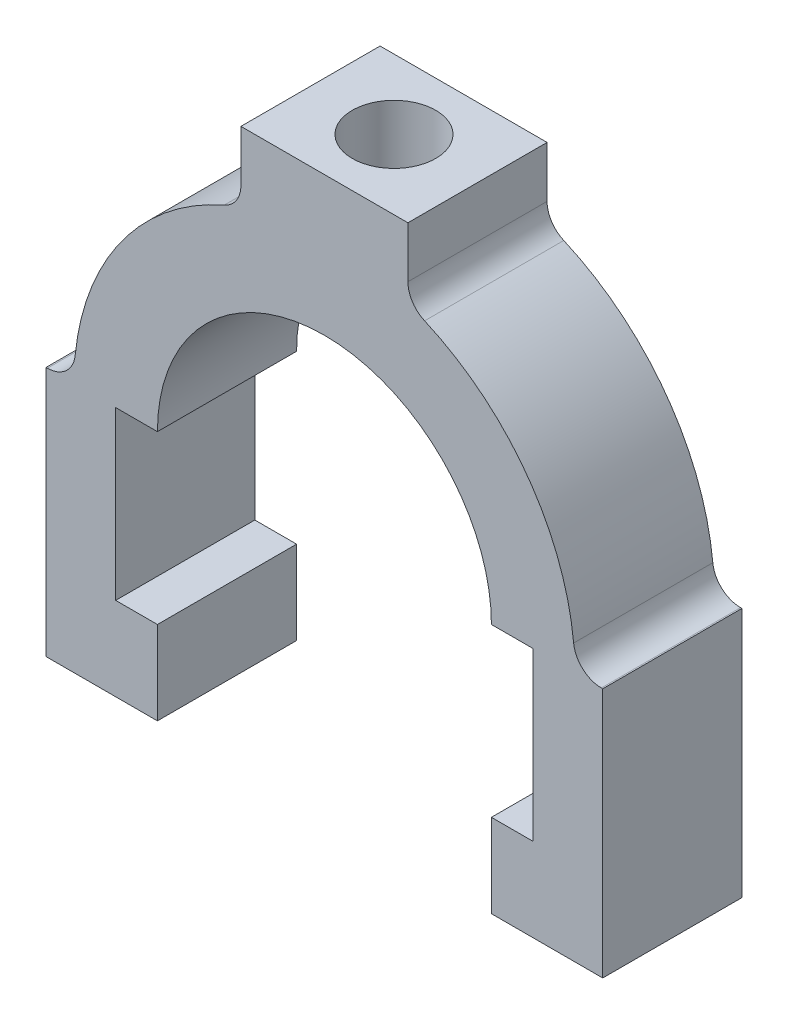
ISO-10303-21;
HEADER;
FILE_DESCRIPTION(('STEP AP214'),'2;1');
FILE_NAME('part.step','',(''),(''),'','','');
FILE_SCHEMA(('AUTOMOTIVE_DESIGN { 1 0 10303 214 1 1 1 1 }'));
ENDSEC;
DATA;
#1=APPLICATION_CONTEXT('core data for automotive mechanical design processes');
#2=APPLICATION_PROTOCOL_DEFINITION('international standard','automotive_design',2000,#1);
#3=PRODUCT_CONTEXT('',#1,'mechanical');
#4=PRODUCT('Part','Part','',(#3));
#5=PRODUCT_RELATED_PRODUCT_CATEGORY('part','',(#4));
#6=PRODUCT_DEFINITION_FORMATION('','',#4);
#7=PRODUCT_DEFINITION_CONTEXT('part definition',#1,'design');
#8=PRODUCT_DEFINITION('design','',#6,#7);
#9=PRODUCT_DEFINITION_SHAPE('','',#8);
#10=(LENGTH_UNIT() NAMED_UNIT(*) SI_UNIT(.MILLI.,.METRE.));
#11=(NAMED_UNIT(*) PLANE_ANGLE_UNIT() SI_UNIT($,.RADIAN.));
#12=(NAMED_UNIT(*) SI_UNIT($,.STERADIAN.) SOLID_ANGLE_UNIT());
#13=UNCERTAINTY_MEASURE_WITH_UNIT(LENGTH_MEASURE(1.E-05),#10,'distance_accuracy_value','');
#14=(GEOMETRIC_REPRESENTATION_CONTEXT(3) GLOBAL_UNCERTAINTY_ASSIGNED_CONTEXT((#13)) GLOBAL_UNIT_ASSIGNED_CONTEXT((#10,
#11,#12)) REPRESENTATION_CONTEXT('',''));
#15=CARTESIAN_POINT('',(0.,0.,0.));
#16=DIRECTION('',(0.,0.,1.));
#17=DIRECTION('',(1.,0.,0.));
#18=AXIS2_PLACEMENT_3D('',#15,#16,#17);
#19=CARTESIAN_POINT('',(-24.,12.,10.));
#20=DIRECTION('',(-1.,0.,0.));
#21=DIRECTION('',(0.,-1.,0.));
#22=AXIS2_PLACEMENT_3D('',#19,#20,#21);
#23=PLANE('',#22);
#24=DIRECTION('',(0.,1.,0.));
#25=VECTOR('',#24,1.);
#26=CARTESIAN_POINT('',(-24.,12.,-10.));
#27=LINE('',#26,#25);
#28=CARTESIAN_POINT('',(-24.,0.,-10.));
#29=VERTEX_POINT('',#28);
#30=CARTESIAN_POINT('',(-24.,12.,-10.));
#31=VERTEX_POINT('',#30);
#32=EDGE_CURVE('E215',#29,#31,#27,.T.);
#33=ORIENTED_EDGE('',*,*,#32,.T.);
#34=DIRECTION('',(0.,0.,-1.));
#35=VECTOR('',#34,1.);
#36=CARTESIAN_POINT('',(-24.,12.,10.));
#37=LINE('',#36,#35);
#38=CARTESIAN_POINT('',(-24.,12.,10.));
#39=VERTEX_POINT('',#38);
#40=EDGE_CURVE('E197',#39,#31,#37,.T.);
#41=ORIENTED_EDGE('',*,*,#40,.F.);
#42=DIRECTION('',(0.,1.,0.));
#43=VECTOR('',#42,1.);
#44=CARTESIAN_POINT('',(-24.,12.,10.));
#45=LINE('',#44,#43);
#46=CARTESIAN_POINT('',(-24.,0.,10.));
#47=VERTEX_POINT('',#46);
#48=EDGE_CURVE('E203',#47,#39,#45,.T.);
#49=ORIENTED_EDGE('',*,*,#48,.F.);
#50=DIRECTION('',(0.,0.,-1.));
#51=VECTOR('',#50,1.);
#52=CARTESIAN_POINT('',(-24.,0.,10.));
#53=LINE('',#52,#51);
#54=EDGE_CURVE('E291',#47,#29,#53,.T.);
#55=ORIENTED_EDGE('',*,*,#54,.T.);
#56=EDGE_LOOP('',(#33,#41,#49,#55));
#57=FACE_BOUND('',#56,.T.);
#58=ADVANCED_FACE('F33',(#57),#23,.F.);
#59=CARTESIAN_POINT('',(-30.,12.,10.));
#60=DIRECTION('',(0.,-1.,0.));
#61=DIRECTION('',(0.,0.,-1.));
#62=AXIS2_PLACEMENT_3D('',#59,#60,#61);
#63=PLANE('',#62);
#64=DIRECTION('',(-1.,0.,0.));
#65=VECTOR('',#64,1.);
#66=CARTESIAN_POINT('',(-30.,12.,-10.));
#67=LINE('',#66,#65);
#68=CARTESIAN_POINT('',(-30.,12.,-10.));
#69=VERTEX_POINT('',#68);
#70=EDGE_CURVE('E293',#31,#69,#67,.T.);
#71=ORIENTED_EDGE('',*,*,#70,.T.);
#72=DIRECTION('',(0.,0.,-1.));
#73=VECTOR('',#72,1.);
#74=CARTESIAN_POINT('',(-30.,12.,10.));
#75=LINE('',#74,#73);
#76=CARTESIAN_POINT('',(-30.,12.,10.));
#77=VERTEX_POINT('',#76);
#78=EDGE_CURVE('E200',#77,#69,#75,.T.);
#79=ORIENTED_EDGE('',*,*,#78,.F.);
#80=DIRECTION('',(-1.,0.,0.));
#81=VECTOR('',#80,1.);
#82=CARTESIAN_POINT('',(-30.,12.,10.));
#83=LINE('',#82,#81);
#84=EDGE_CURVE('E193',#39,#77,#83,.T.);
#85=ORIENTED_EDGE('',*,*,#84,.F.);
#86=ORIENTED_EDGE('',*,*,#40,.T.);
#87=EDGE_LOOP('',(#71,#79,#85,#86));
#88=FACE_BOUND('',#87,.T.);
#89=ADVANCED_FACE('F195',(#88),#63,.F.);
#90=CARTESIAN_POINT('',(-30.,36.,10.));
#91=DIRECTION('',(-1.,0.,0.));
#92=DIRECTION('',(0.,-1.,0.));
#93=AXIS2_PLACEMENT_3D('',#90,#91,#92);
#94=PLANE('',#93);
#95=DIRECTION('',(0.,1.,0.));
#96=VECTOR('',#95,1.);
#97=CARTESIAN_POINT('',(-30.,36.,-10.));
#98=LINE('',#97,#96);
#99=CARTESIAN_POINT('',(-30.,36.,-10.));
#100=VERTEX_POINT('',#99);
#101=EDGE_CURVE('E296',#69,#100,#98,.T.);
#102=ORIENTED_EDGE('',*,*,#101,.T.);
#103=DIRECTION('',(0.,0.,-1.));
#104=VECTOR('',#103,1.);
#105=CARTESIAN_POINT('',(-30.,36.,10.));
#106=LINE('',#105,#104);
#107=CARTESIAN_POINT('',(-30.,36.,10.));
#108=VERTEX_POINT('',#107);
#109=EDGE_CURVE('E221',#108,#100,#106,.T.);
#110=ORIENTED_EDGE('',*,*,#109,.F.);
#111=DIRECTION('',(0.,1.,0.));
#112=VECTOR('',#111,1.);
#113=CARTESIAN_POINT('',(-30.,36.,10.));
#114=LINE('',#113,#112);
#115=EDGE_CURVE('E202',#77,#108,#114,.T.);
#116=ORIENTED_EDGE('',*,*,#115,.F.);
#117=ORIENTED_EDGE('',*,*,#78,.T.);
#118=EDGE_LOOP('',(#102,#110,#116,#117));
#119=FACE_BOUND('',#118,.T.);
#120=ADVANCED_FACE('F446',(#119),#94,.F.);
#121=CARTESIAN_POINT('',(-24.,36.,10.));
#122=DIRECTION('',(0.,1.,0.));
#123=DIRECTION('',(0.,0.,1.));
#124=AXIS2_PLACEMENT_3D('',#121,#122,#123);
#125=PLANE('',#124);
#126=DIRECTION('',(1.,0.,0.));
#127=VECTOR('',#126,1.);
#128=CARTESIAN_POINT('',(-24.,36.,-10.));
#129=LINE('',#128,#127);
#130=CARTESIAN_POINT('',(-24.,36.,-10.));
#131=VERTEX_POINT('',#130);
#132=EDGE_CURVE('E298',#100,#131,#129,.T.);
#133=ORIENTED_EDGE('',*,*,#132,.T.);
#134=DIRECTION('',(0.,0.,-1.));
#135=VECTOR('',#134,1.);
#136=CARTESIAN_POINT('',(-24.,36.,10.));
#137=LINE('',#136,#135);
#138=CARTESIAN_POINT('',(-24.,36.,10.));
#139=VERTEX_POINT('',#138);
#140=EDGE_CURVE('E362',#139,#131,#137,.T.);
#141=ORIENTED_EDGE('',*,*,#140,.F.);
#142=DIRECTION('',(1.,0.,0.));
#143=VECTOR('',#142,1.);
#144=CARTESIAN_POINT('',(-24.,36.,10.));
#145=LINE('',#144,#143);
#146=EDGE_CURVE('E371',#108,#139,#145,.T.);
#147=ORIENTED_EDGE('',*,*,#146,.F.);
#148=ORIENTED_EDGE('',*,*,#109,.T.);
#149=EDGE_LOOP('',(#133,#141,#147,#148));
#150=FACE_BOUND('',#149,.T.);
#151=ADVANCED_FACE('F369',(#150),#125,.F.);
#152=CARTESIAN_POINT('',(0.,36.,10.));
#153=DIRECTION('',(0.,0.,-1.));
#154=DIRECTION('',(-1.,0.,0.));
#155=AXIS2_PLACEMENT_3D('',#152,#153,#154);
#156=CYLINDRICAL_SURFACE('',#155,24.);
#157=CARTESIAN_POINT('',(0.,60.,6.));
#158=CARTESIAN_POINT('',(0.165805387403802,60.0000029962766,6.00000494897359));
#159=CARTESIAN_POINT('',(0.331556618095783,59.9982792337243,5.99312612510757));
#160=CARTESIAN_POINT('',(0.661898341499742,59.9914389070726,5.96568013798363));
#161=CARTESIAN_POINT('',(0.826488699612241,59.9863219558732,5.94511141295985));
#162=CARTESIAN_POINT('',(1.15331468289425,59.9728312747808,5.89044428060452));
#163=CARTESIAN_POINT('',(1.31554956136034,59.964456534561,5.85634167599155));
#164=CARTESIAN_POINT('',(1.63652999353389,59.9446785682942,5.77487607210351));
#165=CARTESIAN_POINT('',(1.7952742379173,59.9332742261501,5.72750818558487));
#166=CARTESIAN_POINT('',(2.10785890827135,59.9077704080524,5.61998280172962));
#167=CARTESIAN_POINT('',(2.26170674963502,59.8936752583917,5.55984581741775));
#168=CARTESIAN_POINT('',(2.56378623821258,59.8631527081916,5.42717458978423));
#169=CARTESIAN_POINT('',(2.71201578712804,59.8467244469549,5.35463576933752));
#170=CARTESIAN_POINT('',(3.00177661033544,59.8119848981805,5.19773725487093));
#171=CARTESIAN_POINT('',(3.14331029693631,59.7936742964516,5.11338186204822));
#172=CARTESIAN_POINT('',(3.41888526654491,59.7556431475739,4.93338823540961));
#173=CARTESIAN_POINT('',(3.5529237053449,59.7359220715781,4.8377457607558));
#174=CARTESIAN_POINT('',(3.81496434602383,59.6952304700178,4.63401408275085));
#175=CARTESIAN_POINT('',(3.94281308913214,59.674243775966,4.52573068744439));
#176=CARTESIAN_POINT('',(4.18902736841679,59.6319204183454,4.29884696688901));
#177=CARTESIAN_POINT('',(4.30738936846955,59.6105836278175,4.1802428286891));
#178=CARTESIAN_POINT('',(4.53377489524013,59.5681596204781,3.93356111670132));
#179=CARTESIAN_POINT('',(4.64180103185487,59.5470723418473,3.80548594899046));
#180=CARTESIAN_POINT('',(4.8468631629984,59.5057198367545,3.54061858346323));
#181=CARTESIAN_POINT('',(4.94389508557169,59.4854549166434,3.40382318503403));
#182=CARTESIAN_POINT('',(5.12757579334233,59.4460427828086,3.12039938605442));
#183=CARTESIAN_POINT('',(5.21405329073272,59.4269160793509,2.97365702103662));
#184=CARTESIAN_POINT('',(5.37434099239073,59.3906650895731,2.67310368885841));
#185=CARTESIAN_POINT('',(5.4481464054103,59.3735415614194,2.51929007584012));
#186=CARTESIAN_POINT('',(5.5824381696205,59.3418328254504,2.20577119001699));
#187=CARTESIAN_POINT('',(5.64293112700069,59.3272463593972,2.04606888557205));
#188=CARTESIAN_POINT('',(5.75016256060697,59.301043510543,1.7218770109329));
#189=CARTESIAN_POINT('',(5.79689611131117,59.2894281915328,1.5573857495113));
#190=CARTESIAN_POINT('',(5.91415157316671,59.2600431044562,1.06517830741339));
#191=CARTESIAN_POINT('',(5.96458986092325,59.2470332112981,0.73201638292385));
#192=CARTESIAN_POINT('',(5.99795848349603,59.23842608856,0.229851548639673));
#193=CARTESIAN_POINT('',(6.00202663613951,59.2373766993858,0.0619945228304855));
#194=CARTESIAN_POINT('',(5.99610970800768,59.2389046091482,-0.27347564915579));
#195=CARTESIAN_POINT('',(5.98612448822743,59.2414819439575,-0.441088792904171));
#196=CARTESIAN_POINT('',(5.93594713474591,59.2543754061852,-0.933475761770903));
#197=CARTESIAN_POINT('',(5.87607363848321,59.2697164452628,-1.25633223496995));
#198=CARTESIAN_POINT('',(5.70489646981085,59.3122664593645,-1.8870944582585));
#199=CARTESIAN_POINT('',(5.59358913348967,59.3394762798586,-2.19499914152381));
#200=CARTESIAN_POINT('',(5.32155798729425,59.4030050803748,-2.79093839902315));
#201=CARTESIAN_POINT('',(5.16034668919654,59.4394132393811,-3.07874102164537));
#202=CARTESIAN_POINT('',(4.79342508379136,59.5171882932266,-3.62367850518203));
#203=CARTESIAN_POINT('',(4.58770698972655,59.5585560552156,-3.88080798740028));
#204=CARTESIAN_POINT('',(4.13065370439076,59.6430352608536,-4.36481343927083));
#205=CARTESIAN_POINT('',(3.8781850342093,59.6861627896442,-4.59061768606056));
#206=CARTESIAN_POINT('',(3.33844766846889,59.7682386126258,-4.99688524404883));
#207=CARTESIAN_POINT('',(3.05117791031428,59.8071867791381,-5.17734717027457));
#208=CARTESIAN_POINT('',(2.44846355524484,59.8767092866156,-5.48820227142574));
#209=CARTESIAN_POINT('',(2.1329255733586,59.9072544059235,-5.61842134270581));
#210=CARTESIAN_POINT('',(1.48350403204752,59.9563166788424,-5.82366924114669));
#211=CARTESIAN_POINT('',(1.14962399502517,59.9748361331613,-5.89870862545545));
#212=CARTESIAN_POINT('',(0.482159883096525,59.9974199712544,-5.9898302624469));
#213=CARTESIAN_POINT('',(0.148786885522346,60.0018421411353,-6.00737212251991));
#214=CARTESIAN_POINT('',(-0.516131504775045,59.9967521917739,-5.987003973561));
#215=CARTESIAN_POINT('',(-0.847677059317271,59.987241326857,-5.94909895615002));
#216=CARTESIAN_POINT('',(-1.49445705467441,59.9555832478693,-5.82011643801129));
#217=CARTESIAN_POINT('',(-1.80986040015949,59.9336253776701,-5.72983521259678));
#218=CARTESIAN_POINT('',(-2.42102924553323,59.8795482551267,-5.49957139735456));
#219=CARTESIAN_POINT('',(-2.71679275860286,59.8474279766146,-5.35958378815815));
#220=CARTESIAN_POINT('',(-3.28609225023473,59.775732355911,-5.03105649673875));
#221=CARTESIAN_POINT('',(-3.55914068563651,59.7360348408855,-4.84169935921243));
#222=CARTESIAN_POINT('',(-4.07010753646663,59.6537802212633,-4.4208365553548));
#223=CARTESIAN_POINT('',(-4.30801987625635,59.6112226239559,-4.18932361497455));
#224=CARTESIAN_POINT('',(-4.74795813275243,59.526758837948,-3.68400673238292));
#225=CARTESIAN_POINT('',(-4.94895984477464,59.4848942795269,-3.40930420781708));
#226=CARTESIAN_POINT('',(-5.30205866107055,59.4077130231476,-2.82901444475306));
#227=CARTESIAN_POINT('',(-5.45415793615243,59.3723960345683,-2.52342857797646));
#228=CARTESIAN_POINT('',(-5.64160870712871,59.3275859445682,-2.04963988098464));
#229=CARTESIAN_POINT('',(-5.69722158138528,59.3140336618751,-1.88955672170373));
#230=CARTESIAN_POINT('',(-5.79475769208555,59.2899834650234,-1.56506517030486));
#231=CARTESIAN_POINT('',(-5.83668611505733,59.2794843938355,-1.40065844244639));
#232=CARTESIAN_POINT('',(-5.9064899745362,59.2618715740422,-1.06871705134067));
#233=CARTESIAN_POINT('',(-5.93436517338602,59.2547578826878,-0.901182335244977));
#234=CARTESIAN_POINT('',(-5.97582085063046,59.2441396190328,-0.564242133634932));
#235=CARTESIAN_POINT('',(-5.98940200008078,59.2406348773048,-0.394836736319862));
#236=CARTESIAN_POINT('',(-6.0019634728535,59.2373938489065,-0.0603310550560219));
#237=CARTESIAN_POINT('',(-6.0013522054121,59.2375521518778,0.104753031347132));
#238=CARTESIAN_POINT('',(-5.98653576306369,59.2413736324535,0.434266500156853));
#239=CARTESIAN_POINT('',(-5.97233089751311,59.2450367302975,0.598695897377004));
#240=CARTESIAN_POINT('',(-5.93044575509701,59.2557579721328,0.925741034412186));
#241=CARTESIAN_POINT('',(-5.90276341290372,59.2628166364686,1.08835649234576));
#242=CARTESIAN_POINT('',(-5.83416667908453,59.2801148571724,1.41053766685843));
#243=CARTESIAN_POINT('',(-5.79325695086328,59.2903532924405,1.57010443730573));
#244=CARTESIAN_POINT('',(-5.69880203716712,59.313644179093,1.88425238632614));
#245=CARTESIAN_POINT('',(-5.64532943643257,59.3266804293978,2.0388566126103));
#246=CARTESIAN_POINT('',(-5.52605852883571,59.3552228194459,2.34293422358708));
#247=CARTESIAN_POINT('',(-5.46026449802037,59.3707281020539,2.49240936705426));
#248=CARTESIAN_POINT('',(-5.31678835542035,59.4037855982137,2.78538674498687));
#249=CARTESIAN_POINT('',(-5.23910089912543,59.4213387311534,2.92888625714214));
#250=CARTESIAN_POINT('',(-5.07243073970643,59.4579990976357,3.20889145660903));
#251=CARTESIAN_POINT('',(-4.98345174049215,59.4771058208267,3.34539941680807));
#252=CARTESIAN_POINT('',(-4.7922729032838,59.5168854335111,3.61414267908367));
#253=CARTESIAN_POINT('',(-4.68978556121475,59.5375863850894,3.7461693832206));
#254=CARTESIAN_POINT('',(-4.4742434518464,59.579507882839,4.00112512843301));
#255=CARTESIAN_POINT('',(-4.36119228671727,59.6007282500856,4.12405724524823));
#256=CARTESIAN_POINT('',(-4.12516419546941,59.6431258862839,4.36014888533437));
#257=CARTESIAN_POINT('',(-4.0021814457299,59.6643031223737,4.47330259312072));
#258=CARTESIAN_POINT('',(-3.7471917650141,59.7060168559165,4.68896867790356));
#259=CARTESIAN_POINT('',(-3.61518813420472,59.7265535837286,4.7914849122748));
#260=CARTESIAN_POINT('',(-3.34044186706076,59.7668061369628,4.9870231939444));
#261=CARTESIAN_POINT('',(-3.19754553860501,59.7864996932668,5.07983406105877));
#262=CARTESIAN_POINT('',(-2.90425652857033,59.824087485808,5.25302670133399));
#263=CARTESIAN_POINT('',(-2.75386663022821,59.8419823827553,5.33341304433248));
#264=CARTESIAN_POINT('',(-2.44663692885417,59.8754647710401,5.48114948715895));
#265=CARTESIAN_POINT('',(-2.2897999415517,59.8910532562916,5.54850520621223));
#266=CARTESIAN_POINT('',(-1.97079001830644,59.9194829588902,5.66966635549291));
#267=CARTESIAN_POINT('',(-1.80861789148403,59.9323245906257,5.72347382981596));
#268=CARTESIAN_POINT('',(-1.3777763047293,59.9619049568243,5.84623285390434));
#269=CARTESIAN_POINT('',(-1.1055914726577,59.9761014751911,5.90379537784075));
#270=CARTESIAN_POINT('',(-0.555553502444541,59.9951461360495,5.98067336813905));
#271=CARTESIAN_POINT('',(-0.277700792219542,59.9999949816564,5.99999171116267));
#272=CARTESIAN_POINT('',(0.,60.,6.));
#273=B_SPLINE_CURVE_WITH_KNOTS('',3,(#157,#158,#159,#160,#161,#162,#163,#164,#165,#166,#167,
#168,#169,#170,#171,#172,#173,#174,#175,#176,#177,#178,#179,#180,#181,#182,#183,#184,#185,#186,
#187,#188,#189,#190,#191,#192,#193,#194,#195,#196,#197,#198,#199,#200,#201,#202,#203,#204,#205,
#206,#207,#208,#209,#210,#211,#212,#213,#214,#215,#216,#217,#218,#219,#220,#221,#222,#223,#224,
#225,#226,#227,#228,#229,#230,#231,#232,#233,#234,#235,#236,#237,#238,#239,#240,#241,#242,#243,
#244,#245,#246,#247,#248,#249,#250,#251,#252,#253,#254,#255,#256,#257,#258,#259,#260,#261,#262,
#263,#264,#265,#266,#267,#268,#269,#270,#271,#272),.UNSPECIFIED.,.T.,.F.,(4,2,2,2,2,2,2,2,2,2,2,
2,2,2,2,2,2,2,2,2,2,2,2,2,2,2,2,2,2,2,2,2,2,2,2,2,2,2,2,2,2,2,2,2,2,2,2,2,2,2,2,2,2,2,2,2,2,4),
(0.,0.497171453608337,0.994399635056343,1.49178214324908,1.98934814054333,2.48612078574438,
2.98307717135303,3.47985313409878,3.97681634579053,4.48278784834555,4.98894707988207,
5.49497816255321,6.00119605682159,6.51476681838441,7.02853133276356,7.54204031819885,
8.0557329040678,9.06140626133586,9.56463055957973,10.0678598353591,11.0489981911534,
12.0302064495334,13.021319425847,14.0126059443384,15.0321583496526,16.0517418932217,
17.0748274712564,18.0977172584376,19.0944306688629,20.0910543554016,21.0729092914533,
22.0548634037835,23.0542418135059,24.0537928312126,25.0778786790709,26.1019190608722,
26.6114255778037,27.1207387624019,27.6300605598219,28.1393584452954,28.6340191333343,
29.1286685643954,29.6233938208458,30.1179448483897,30.6097058740945,31.10129655354,
31.593108789452,32.0847601135969,32.5894192432003,33.0939069121446,33.5986925778495,
34.1032945530713,34.6172488082311,35.1310135748031,35.6445562931573,36.1580214841036,
36.9907766489356,37.8234691729712),.UNSPECIFIED.);
#274=CARTESIAN_POINT('',(0.,60.,6.));
#275=VERTEX_POINT('',#274);
#276=EDGE_CURVE('E294',#275,#275,#273,.T.);
#277=ORIENTED_EDGE('',*,*,#276,.T.);
#278=EDGE_LOOP('',(#277));
#279=FACE_BOUND('',#278,.T.);
#280=CARTESIAN_POINT('',(0.,36.,-10.));
#281=DIRECTION('',(0.,0.,-1.));
#282=DIRECTION('',(1.,0.,0.));
#283=AXIS2_PLACEMENT_3D('',#280,#281,#282);
#284=CIRCLE('',#283,24.);
#285=CARTESIAN_POINT('',(24.,36.,-10.));
#286=VERTEX_POINT('',#285);
#287=EDGE_CURVE('E300',#131,#286,#284,.T.);
#288=ORIENTED_EDGE('',*,*,#287,.T.);
#289=DIRECTION('',(0.,0.,-1.));
#290=VECTOR('',#289,1.);
#291=CARTESIAN_POINT('',(24.,36.,10.));
#292=LINE('',#291,#290);
#293=CARTESIAN_POINT('',(24.,36.,10.));
#294=VERTEX_POINT('',#293);
#295=EDGE_CURVE('E359',#294,#286,#292,.T.);
#296=ORIENTED_EDGE('',*,*,#295,.F.);
#297=CARTESIAN_POINT('',(0.,36.,10.));
#298=DIRECTION('',(0.,0.,-1.));
#299=DIRECTION('',(1.,0.,0.));
#300=AXIS2_PLACEMENT_3D('',#297,#298,#299);
#301=CIRCLE('',#300,24.);
#302=EDGE_CURVE('E388',#139,#294,#301,.T.);
#303=ORIENTED_EDGE('',*,*,#302,.F.);
#304=ORIENTED_EDGE('',*,*,#140,.T.);
#305=EDGE_LOOP('',(#288,#296,#303,#304));
#306=FACE_BOUND('',#305,.T.);
#307=ADVANCED_FACE('F379',(#279,#306),#156,.F.);
#308=CARTESIAN_POINT('',(24.,36.,10.));
#309=DIRECTION('',(0.,1.,0.));
#310=DIRECTION('',(0.,0.,1.));
#311=AXIS2_PLACEMENT_3D('',#308,#309,#310);
#312=PLANE('',#311);
#313=DIRECTION('',(1.,0.,0.));
#314=VECTOR('',#313,1.);
#315=CARTESIAN_POINT('',(24.,36.,-10.));
#316=LINE('',#315,#314);
#317=CARTESIAN_POINT('',(30.,36.,-10.));
#318=VERTEX_POINT('',#317);
#319=EDGE_CURVE('E302',#286,#318,#316,.T.);
#320=ORIENTED_EDGE('',*,*,#319,.T.);
#321=DIRECTION('',(0.,0.,-1.));
#322=VECTOR('',#321,1.);
#323=CARTESIAN_POINT('',(30.,36.,10.));
#324=LINE('',#323,#322);
#325=CARTESIAN_POINT('',(30.,36.,10.));
#326=VERTEX_POINT('',#325);
#327=EDGE_CURVE('E356',#326,#318,#324,.T.);
#328=ORIENTED_EDGE('',*,*,#327,.F.);
#329=DIRECTION('',(1.,0.,0.));
#330=VECTOR('',#329,1.);
#331=CARTESIAN_POINT('',(24.,36.,10.));
#332=LINE('',#331,#330);
#333=EDGE_CURVE('E385',#294,#326,#332,.T.);
#334=ORIENTED_EDGE('',*,*,#333,.F.);
#335=ORIENTED_EDGE('',*,*,#295,.T.);
#336=EDGE_LOOP('',(#320,#328,#334,#335));
#337=FACE_BOUND('',#336,.T.);
#338=ADVANCED_FACE('F383',(#337),#312,.F.);
#339=CARTESIAN_POINT('',(30.,36.,10.));
#340=DIRECTION('',(1.,0.,0.));
#341=DIRECTION('',(0.,1.,0.));
#342=AXIS2_PLACEMENT_3D('',#339,#340,#341);
#343=PLANE('',#342);
#344=DIRECTION('',(0.,-1.,0.));
#345=VECTOR('',#344,1.);
#346=CARTESIAN_POINT('',(30.,36.,-10.));
#347=LINE('',#346,#345);
#348=CARTESIAN_POINT('',(30.,12.,-10.));
#349=VERTEX_POINT('',#348);
#350=EDGE_CURVE('E304',#318,#349,#347,.T.);
#351=ORIENTED_EDGE('',*,*,#350,.T.);
#352=DIRECTION('',(0.,0.,-1.));
#353=VECTOR('',#352,1.);
#354=CARTESIAN_POINT('',(30.,12.,10.));
#355=LINE('',#354,#353);
#356=CARTESIAN_POINT('',(30.,12.,10.));
#357=VERTEX_POINT('',#356);
#358=EDGE_CURVE('E353',#357,#349,#355,.T.);
#359=ORIENTED_EDGE('',*,*,#358,.F.);
#360=DIRECTION('',(0.,-1.,0.));
#361=VECTOR('',#360,1.);
#362=CARTESIAN_POINT('',(30.,36.,10.));
#363=LINE('',#362,#361);
#364=EDGE_CURVE('E387',#326,#357,#363,.T.);
#365=ORIENTED_EDGE('',*,*,#364,.F.);
#366=ORIENTED_EDGE('',*,*,#327,.T.);
#367=EDGE_LOOP('',(#351,#359,#365,#366));
#368=FACE_BOUND('',#367,.T.);
#369=ADVANCED_FACE('F432',(#368),#343,.F.);
#370=CARTESIAN_POINT('',(30.,12.,10.));
#371=DIRECTION('',(0.,-1.,0.));
#372=DIRECTION('',(0.,0.,-1.));
#373=AXIS2_PLACEMENT_3D('',#370,#371,#372);
#374=PLANE('',#373);
#375=DIRECTION('',(-1.,0.,0.));
#376=VECTOR('',#375,1.);
#377=CARTESIAN_POINT('',(30.,12.,-10.));
#378=LINE('',#377,#376);
#379=CARTESIAN_POINT('',(24.,12.,-10.));
#380=VERTEX_POINT('',#379);
#381=EDGE_CURVE('E306',#349,#380,#378,.T.);
#382=ORIENTED_EDGE('',*,*,#381,.T.);
#383=DIRECTION('',(0.,0.,-1.));
#384=VECTOR('',#383,1.);
#385=CARTESIAN_POINT('',(24.,12.,10.));
#386=LINE('',#385,#384);
#387=CARTESIAN_POINT('',(24.,12.,10.));
#388=VERTEX_POINT('',#387);
#389=EDGE_CURVE('E350',#388,#380,#386,.T.);
#390=ORIENTED_EDGE('',*,*,#389,.F.);
#391=DIRECTION('',(-1.,0.,0.));
#392=VECTOR('',#391,1.);
#393=CARTESIAN_POINT('',(30.,12.,10.));
#394=LINE('',#393,#392);
#395=EDGE_CURVE('E390',#357,#388,#394,.T.);
#396=ORIENTED_EDGE('',*,*,#395,.F.);
#397=ORIENTED_EDGE('',*,*,#358,.T.);
#398=EDGE_LOOP('',(#382,#390,#396,#397));
#399=FACE_BOUND('',#398,.T.);
#400=ADVANCED_FACE('F429',(#399),#374,.F.);
#401=CARTESIAN_POINT('',(24.,12.,10.));
#402=DIRECTION('',(1.,0.,0.));
#403=DIRECTION('',(0.,1.,0.));
#404=AXIS2_PLACEMENT_3D('',#401,#402,#403);
#405=PLANE('',#404);
#406=DIRECTION('',(0.,-1.,0.));
#407=VECTOR('',#406,1.);
#408=CARTESIAN_POINT('',(24.,12.,-10.));
#409=LINE('',#408,#407);
#410=CARTESIAN_POINT('',(24.,0.,-10.));
#411=VERTEX_POINT('',#410);
#412=EDGE_CURVE('E308',#380,#411,#409,.T.);
#413=ORIENTED_EDGE('',*,*,#412,.T.);
#414=DIRECTION('',(0.,0.,-1.));
#415=VECTOR('',#414,1.);
#416=CARTESIAN_POINT('',(24.,0.,10.));
#417=LINE('',#416,#415);
#418=CARTESIAN_POINT('',(24.,0.,10.));
#419=VERTEX_POINT('',#418);
#420=EDGE_CURVE('E347',#419,#411,#417,.T.);
#421=ORIENTED_EDGE('',*,*,#420,.F.);
#422=DIRECTION('',(0.,-1.,0.));
#423=VECTOR('',#422,1.);
#424=CARTESIAN_POINT('',(24.,12.,10.));
#425=LINE('',#424,#423);
#426=EDGE_CURVE('E396',#388,#419,#425,.T.);
#427=ORIENTED_EDGE('',*,*,#426,.F.);
#428=ORIENTED_EDGE('',*,*,#389,.T.);
#429=EDGE_LOOP('',(#413,#421,#427,#428));
#430=FACE_BOUND('',#429,.T.);
#431=ADVANCED_FACE('F425',(#430),#405,.F.);
#432=CARTESIAN_POINT('',(24.,0.,10.));
#433=DIRECTION('',(0.,1.,0.));
#434=DIRECTION('',(0.,0.,1.));
#435=AXIS2_PLACEMENT_3D('',#432,#433,#434);
#436=PLANE('',#435);
#437=DIRECTION('',(1.,0.,0.));
#438=VECTOR('',#437,1.);
#439=CARTESIAN_POINT('',(24.,0.,-10.));
#440=LINE('',#439,#438);
#441=CARTESIAN_POINT('',(40.,0.,-10.));
#442=VERTEX_POINT('',#441);
#443=EDGE_CURVE('E310',#411,#442,#440,.T.);
#444=ORIENTED_EDGE('',*,*,#443,.T.);
#445=DIRECTION('',(0.,0.,-1.));
#446=VECTOR('',#445,1.);
#447=CARTESIAN_POINT('',(40.,0.,10.));
#448=LINE('',#447,#446);
#449=CARTESIAN_POINT('',(40.,0.,10.));
#450=VERTEX_POINT('',#449);
#451=EDGE_CURVE('E344',#450,#442,#448,.T.);
#452=ORIENTED_EDGE('',*,*,#451,.F.);
#453=DIRECTION('',(1.,0.,0.));
#454=VECTOR('',#453,1.);
#455=CARTESIAN_POINT('',(24.,0.,10.));
#456=LINE('',#455,#454);
#457=EDGE_CURVE('E398',#419,#450,#456,.T.);
#458=ORIENTED_EDGE('',*,*,#457,.F.);
#459=ORIENTED_EDGE('',*,*,#420,.T.);
#460=EDGE_LOOP('',(#444,#452,#458,#459));
#461=FACE_BOUND('',#460,.T.);
#462=ADVANCED_FACE('F420',(#461),#436,.F.);
#463=CARTESIAN_POINT('',(40.,36.,10.));
#464=DIRECTION('',(-1.,0.,0.));
#465=DIRECTION('',(0.,-1.,0.));
#466=AXIS2_PLACEMENT_3D('',#463,#464,#465);
#467=PLANE('',#466);
#468=DIRECTION('',(0.,1.,0.));
#469=VECTOR('',#468,1.);
#470=CARTESIAN_POINT('',(40.,36.,-10.));
#471=LINE('',#470,#469);
#472=CARTESIAN_POINT('',(40.,36.,-10.));
#473=VERTEX_POINT('',#472);
#474=EDGE_CURVE('E312',#442,#473,#471,.T.);
#475=ORIENTED_EDGE('',*,*,#474,.T.);
#476=DIRECTION('',(0.,0.,-1.));
#477=VECTOR('',#476,1.);
#478=CARTESIAN_POINT('',(40.,36.,10.));
#479=LINE('',#478,#477);
#480=CARTESIAN_POINT('',(40.,36.,10.));
#481=VERTEX_POINT('',#480);
#482=EDGE_CURVE('E341',#481,#473,#479,.T.);
#483=ORIENTED_EDGE('',*,*,#482,.F.);
#484=DIRECTION('',(0.,1.,0.));
#485=VECTOR('',#484,1.);
#486=CARTESIAN_POINT('',(40.,36.,10.));
#487=LINE('',#486,#485);
#488=EDGE_CURVE('E400',#450,#481,#487,.T.);
#489=ORIENTED_EDGE('',*,*,#488,.F.);
#490=ORIENTED_EDGE('',*,*,#451,.T.);
#491=EDGE_LOOP('',(#475,#483,#489,#490));
#492=FACE_BOUND('',#491,.T.);
#493=ADVANCED_FACE('F414',(#492),#467,.F.);
#494=CARTESIAN_POINT('',(36.,36.,10.));
#495=DIRECTION('',(0.,-1.,0.));
#496=DIRECTION('',(0.,0.,-1.));
#497=AXIS2_PLACEMENT_3D('',#494,#495,#496);
#498=PLANE('',#497);
#499=DIRECTION('',(-1.,0.,0.));
#500=VECTOR('',#499,1.);
#501=CARTESIAN_POINT('',(36.,36.,-10.));
#502=LINE('',#501,#500);
#503=CARTESIAN_POINT('',(39.7994974842648,36.,-10.));
#504=VERTEX_POINT('',#503);
#505=EDGE_CURVE('E263',#473,#504,#502,.T.);
#506=ORIENTED_EDGE('',*,*,#505,.T.);
#507=DIRECTION('',(0.,0.,1.));
#508=VECTOR('',#507,1.);
#509=CARTESIAN_POINT('',(39.7994974842648,36.,10.));
#510=LINE('',#509,#508);
#511=CARTESIAN_POINT('',(39.7994974842648,36.,10.));
#512=VERTEX_POINT('',#511);
#513=EDGE_CURVE('E236',#504,#512,#510,.T.);
#514=ORIENTED_EDGE('',*,*,#513,.T.);
#515=DIRECTION('',(-1.,0.,0.));
#516=VECTOR('',#515,1.);
#517=CARTESIAN_POINT('',(36.,36.,10.));
#518=LINE('',#517,#516);
#519=EDGE_CURVE('E277',#481,#512,#518,.T.);
#520=ORIENTED_EDGE('',*,*,#519,.F.);
#521=ORIENTED_EDGE('',*,*,#482,.T.);
#522=EDGE_LOOP('',(#506,#514,#520,#521));
#523=FACE_BOUND('',#522,.T.);
#524=ADVANCED_FACE('F412',(#523),#498,.F.);
#525=CARTESIAN_POINT('',(0.,36.,10.));
#526=DIRECTION('',(0.,0.,-1.));
#527=DIRECTION('',(-1.,0.,0.));
#528=AXIS2_PLACEMENT_3D('',#525,#526,#527);
#529=CYLINDRICAL_SURFACE('',#528,36.);
#530=CARTESIAN_POINT('',(0.,36.,10.));
#531=DIRECTION('',(0.,0.,1.));
#532=DIRECTION('',(1.,0.,0.));
#533=AXIS2_PLACEMENT_3D('',#530,#531,#532);
#534=CIRCLE('',#533,36.);
#535=CARTESIAN_POINT('',(35.8195477358383,39.6,10.));
#536=VERTEX_POINT('',#535);
#537=CARTESIAN_POINT('',(14.4,68.994545003682,10.));
#538=VERTEX_POINT('',#537);
#539=EDGE_CURVE('E273',#536,#538,#534,.T.);
#540=ORIENTED_EDGE('',*,*,#539,.F.);
#541=DIRECTION('',(0.,0.,-1.));
#542=VECTOR('',#541,1.);
#543=CARTESIAN_POINT('',(35.8195477358383,39.6,10.));
#544=LINE('',#543,#542);
#545=CARTESIAN_POINT('',(35.8195477358383,39.6,-10.));
#546=VERTEX_POINT('',#545);
#547=EDGE_CURVE('E233',#536,#546,#544,.T.);
#548=ORIENTED_EDGE('',*,*,#547,.T.);
#549=CARTESIAN_POINT('',(0.,36.,-10.));
#550=DIRECTION('',(0.,0.,1.));
#551=DIRECTION('',(1.,0.,0.));
#552=AXIS2_PLACEMENT_3D('',#549,#550,#551);
#553=CIRCLE('',#552,36.);
#554=CARTESIAN_POINT('',(14.4,68.994545003682,-10.));
#555=VERTEX_POINT('',#554);
#556=EDGE_CURVE('E256',#546,#555,#553,.T.);
#557=ORIENTED_EDGE('',*,*,#556,.T.);
#558=DIRECTION('',(0.,0.,-1.));
#559=VECTOR('',#558,1.);
#560=CARTESIAN_POINT('',(14.4,68.994545003682,10.));
#561=LINE('',#560,#559);
#562=EDGE_CURVE('E231',#555,#538,#561,.F.);
#563=ORIENTED_EDGE('',*,*,#562,.T.);
#564=EDGE_LOOP('',(#540,#548,#557,#563));
#565=FACE_BOUND('',#564,.T.);
#566=ADVANCED_FACE('F261',(#565),#529,.T.);
#567=CARTESIAN_POINT('',(12.,80.,10.));
#568=DIRECTION('',(-1.,0.,0.));
#569=DIRECTION('',(0.,0.,1.));
#570=AXIS2_PLACEMENT_3D('',#567,#568,#569);
#571=PLANE('',#570);
#572=DIRECTION('',(0.,1.,0.));
#573=VECTOR('',#572,1.);
#574=CARTESIAN_POINT('',(12.,80.,10.));
#575=LINE('',#574,#573);
#576=CARTESIAN_POINT('',(12.,72.6606055596467,10.));
#577=VERTEX_POINT('',#576);
#578=CARTESIAN_POINT('',(12.,80.,10.));
#579=VERTEX_POINT('',#578);
#580=EDGE_CURVE('E269',#577,#579,#575,.T.);
#581=ORIENTED_EDGE('',*,*,#580,.F.);
#582=DIRECTION('',(0.,0.,1.));
#583=VECTOR('',#582,1.);
#584=CARTESIAN_POINT('',(12.,72.6606055596467,-10.));
#585=LINE('',#584,#583);
#586=CARTESIAN_POINT('',(12.,72.6606055596467,-10.));
#587=VERTEX_POINT('',#586);
#588=EDGE_CURVE('E238',#577,#587,#585,.F.);
#589=ORIENTED_EDGE('',*,*,#588,.T.);
#590=DIRECTION('',(0.,1.,0.));
#591=VECTOR('',#590,1.);
#592=CARTESIAN_POINT('',(12.,80.,-10.));
#593=LINE('',#592,#591);
#594=CARTESIAN_POINT('',(12.,80.,-10.));
#595=VERTEX_POINT('',#594);
#596=EDGE_CURVE('E258',#587,#595,#593,.T.);
#597=ORIENTED_EDGE('',*,*,#596,.T.);
#598=DIRECTION('',(0.,0.,-1.));
#599=VECTOR('',#598,1.);
#600=CARTESIAN_POINT('',(12.,80.,10.));
#601=LINE('',#600,#599);
#602=EDGE_CURVE('E270',#579,#595,#601,.T.);
#603=ORIENTED_EDGE('',*,*,#602,.F.);
#604=EDGE_LOOP('',(#581,#589,#597,#603));
#605=FACE_BOUND('',#604,.T.);
#606=ADVANCED_FACE('F266',(#605),#571,.F.);
#607=CARTESIAN_POINT('',(-12.,80.,10.));
#608=DIRECTION('',(0.,-1.,0.));
#609=DIRECTION('',(0.,0.,-1.));
#610=AXIS2_PLACEMENT_3D('',#607,#608,#609);
#611=PLANE('',#610);
#612=CARTESIAN_POINT('',(0.,80.,0.));
#613=DIRECTION('',(0.,1.,0.));
#614=DIRECTION('',(0.,0.,1.));
#615=AXIS2_PLACEMENT_3D('',#612,#613,#614);
#616=CIRCLE('',#615,6.);
#617=CARTESIAN_POINT('',(0.,80.,6.));
#618=VERTEX_POINT('',#617);
#619=EDGE_CURVE('E674',#618,#618,#616,.T.);
#620=ORIENTED_EDGE('',*,*,#619,.F.);
#621=EDGE_LOOP('',(#620));
#622=FACE_BOUND('',#621,.T.);
#623=DIRECTION('',(-1.,0.,0.));
#624=VECTOR('',#623,1.);
#625=CARTESIAN_POINT('',(-12.,80.,-10.));
#626=LINE('',#625,#624);
#627=CARTESIAN_POINT('',(-12.,80.,-10.));
#628=VERTEX_POINT('',#627);
#629=EDGE_CURVE('E317',#595,#628,#626,.T.);
#630=ORIENTED_EDGE('',*,*,#629,.T.);
#631=DIRECTION('',(0.,0.,-1.));
#632=VECTOR('',#631,1.);
#633=CARTESIAN_POINT('',(-12.,80.,10.));
#634=LINE('',#633,#632);
#635=CARTESIAN_POINT('',(-12.,80.,10.));
#636=VERTEX_POINT('',#635);
#637=EDGE_CURVE('E337',#636,#628,#634,.T.);
#638=ORIENTED_EDGE('',*,*,#637,.F.);
#639=DIRECTION('',(-1.,0.,0.));
#640=VECTOR('',#639,1.);
#641=CARTESIAN_POINT('',(-12.,80.,10.));
#642=LINE('',#641,#640);
#643=EDGE_CURVE('E272',#579,#636,#642,.T.);
#644=ORIENTED_EDGE('',*,*,#643,.F.);
#645=ORIENTED_EDGE('',*,*,#602,.T.);
#646=EDGE_LOOP('',(#630,#638,#644,#645));
#647=FACE_BOUND('',#646,.T.);
#648=ADVANCED_FACE('F534',(#622,#647),#611,.F.);
#649=CARTESIAN_POINT('',(-12.,80.,10.));
#650=DIRECTION('',(1.,0.,0.));
#651=DIRECTION('',(0.,0.,-1.));
#652=AXIS2_PLACEMENT_3D('',#649,#650,#651);
#653=PLANE('',#652);
#654=DIRECTION('',(0.,-1.,0.));
#655=VECTOR('',#654,1.);
#656=CARTESIAN_POINT('',(-12.,80.,-10.));
#657=LINE('',#656,#655);
#658=CARTESIAN_POINT('',(-12.,72.6606055596467,-10.));
#659=VERTEX_POINT('',#658);
#660=EDGE_CURVE('E319',#628,#659,#657,.T.);
#661=ORIENTED_EDGE('',*,*,#660,.T.);
#662=DIRECTION('',(0.,0.,1.));
#663=VECTOR('',#662,1.);
#664=CARTESIAN_POINT('',(-12.,72.6606055596467,10.));
#665=LINE('',#664,#663);
#666=CARTESIAN_POINT('',(-12.,72.6606055596467,10.));
#667=VERTEX_POINT('',#666);
#668=EDGE_CURVE('E229',#659,#667,#665,.T.);
#669=ORIENTED_EDGE('',*,*,#668,.T.);
#670=DIRECTION('',(0.,-1.,0.));
#671=VECTOR('',#670,1.);
#672=CARTESIAN_POINT('',(-12.,80.,10.));
#673=LINE('',#672,#671);
#674=EDGE_CURVE('E275',#636,#667,#673,.T.);
#675=ORIENTED_EDGE('',*,*,#674,.F.);
#676=ORIENTED_EDGE('',*,*,#637,.T.);
#677=EDGE_LOOP('',(#661,#669,#675,#676));
#678=FACE_BOUND('',#677,.T.);
#679=ADVANCED_FACE('F524',(#678),#653,.F.);
#680=CARTESIAN_POINT('',(0.,36.,10.));
#681=DIRECTION('',(0.,0.,-1.));
#682=DIRECTION('',(-1.,0.,0.));
#683=AXIS2_PLACEMENT_3D('',#680,#681,#682);
#684=CYLINDRICAL_SURFACE('',#683,36.);
#685=CARTESIAN_POINT('',(0.,36.,-10.));
#686=DIRECTION('',(0.,0.,1.));
#687=DIRECTION('',(-1.,0.,0.));
#688=AXIS2_PLACEMENT_3D('',#685,#686,#687);
#689=CIRCLE('',#688,36.);
#690=CARTESIAN_POINT('',(-14.4,68.994545003682,-10.));
#691=VERTEX_POINT('',#690);
#692=CARTESIAN_POINT('',(-35.8195477358383,39.6,-10.));
#693=VERTEX_POINT('',#692);
#694=EDGE_CURVE('E322',#691,#693,#689,.T.);
#695=ORIENTED_EDGE('',*,*,#694,.T.);
#696=DIRECTION('',(0.,0.,-1.));
#697=VECTOR('',#696,1.);
#698=CARTESIAN_POINT('',(-35.8195477358383,39.6,10.));
#699=LINE('',#698,#697);
#700=CARTESIAN_POINT('',(-35.8195477358383,39.6,10.));
#701=VERTEX_POINT('',#700);
#702=EDGE_CURVE('E227',#693,#701,#699,.F.);
#703=ORIENTED_EDGE('',*,*,#702,.T.);
#704=CARTESIAN_POINT('',(0.,36.,10.));
#705=DIRECTION('',(0.,0.,1.));
#706=DIRECTION('',(-1.,0.,0.));
#707=AXIS2_PLACEMENT_3D('',#704,#705,#706);
#708=CIRCLE('',#707,36.);
#709=CARTESIAN_POINT('',(-14.4,68.994545003682,10.));
#710=VERTEX_POINT('',#709);
#711=EDGE_CURVE('E283',#710,#701,#708,.T.);
#712=ORIENTED_EDGE('',*,*,#711,.F.);
#713=DIRECTION('',(0.,0.,-1.));
#714=VECTOR('',#713,1.);
#715=CARTESIAN_POINT('',(-14.4,68.994545003682,10.));
#716=LINE('',#715,#714);
#717=EDGE_CURVE('E219',#710,#691,#716,.T.);
#718=ORIENTED_EDGE('',*,*,#717,.T.);
#719=EDGE_LOOP('',(#695,#703,#712,#718));
#720=FACE_BOUND('',#719,.T.);
#721=ADVANCED_FACE('F512',(#720),#684,.T.);
#722=CARTESIAN_POINT('',(-36.,36.,10.));
#723=DIRECTION('',(0.,-1.,0.));
#724=DIRECTION('',(0.,0.,-1.));
#725=AXIS2_PLACEMENT_3D('',#722,#723,#724);
#726=PLANE('',#725);
#727=DIRECTION('',(-1.,0.,0.));
#728=VECTOR('',#727,1.);
#729=CARTESIAN_POINT('',(-36.,36.,10.));
#730=LINE('',#729,#728);
#731=CARTESIAN_POINT('',(-39.7994974842648,36.,10.));
#732=VERTEX_POINT('',#731);
#733=CARTESIAN_POINT('',(-40.,36.,10.));
#734=VERTEX_POINT('',#733);
#735=EDGE_CURVE('E286',#732,#734,#730,.T.);
#736=ORIENTED_EDGE('',*,*,#735,.F.);
#737=DIRECTION('',(0.,0.,1.));
#738=VECTOR('',#737,1.);
#739=CARTESIAN_POINT('',(-39.7994974842648,36.,-10.));
#740=LINE('',#739,#738);
#741=CARTESIAN_POINT('',(-39.7994974842648,36.,-10.));
#742=VERTEX_POINT('',#741);
#743=EDGE_CURVE('E216',#732,#742,#740,.F.);
#744=ORIENTED_EDGE('',*,*,#743,.T.);
#745=DIRECTION('',(-1.,0.,0.));
#746=VECTOR('',#745,1.);
#747=CARTESIAN_POINT('',(-36.,36.,-10.));
#748=LINE('',#747,#746);
#749=CARTESIAN_POINT('',(-40.,36.,-10.));
#750=VERTEX_POINT('',#749);
#751=EDGE_CURVE('E325',#742,#750,#748,.T.);
#752=ORIENTED_EDGE('',*,*,#751,.T.);
#753=DIRECTION('',(0.,0.,-1.));
#754=VECTOR('',#753,1.);
#755=CARTESIAN_POINT('',(-40.,36.,10.));
#756=LINE('',#755,#754);
#757=EDGE_CURVE('E334',#734,#750,#756,.T.);
#758=ORIENTED_EDGE('',*,*,#757,.F.);
#759=EDGE_LOOP('',(#736,#744,#752,#758));
#760=FACE_BOUND('',#759,.T.);
#761=ADVANCED_FACE('F506',(#760),#726,.F.);
#762=CARTESIAN_POINT('',(-40.,36.,10.));
#763=DIRECTION('',(1.,0.,0.));
#764=DIRECTION('',(0.,1.,0.));
#765=AXIS2_PLACEMENT_3D('',#762,#763,#764);
#766=PLANE('',#765);
#767=DIRECTION('',(0.,-1.,0.));
#768=VECTOR('',#767,1.);
#769=CARTESIAN_POINT('',(-40.,36.,-10.));
#770=LINE('',#769,#768);
#771=CARTESIAN_POINT('',(-40.,0.,-10.));
#772=VERTEX_POINT('',#771);
#773=EDGE_CURVE('E327',#750,#772,#770,.T.);
#774=ORIENTED_EDGE('',*,*,#773,.T.);
#775=DIRECTION('',(0.,0.,-1.));
#776=VECTOR('',#775,1.);
#777=CARTESIAN_POINT('',(-40.,0.,10.));
#778=LINE('',#777,#776);
#779=CARTESIAN_POINT('',(-40.,0.,10.));
#780=VERTEX_POINT('',#779);
#781=EDGE_CURVE('E331',#780,#772,#778,.T.);
#782=ORIENTED_EDGE('',*,*,#781,.F.);
#783=DIRECTION('',(0.,-1.,0.));
#784=VECTOR('',#783,1.);
#785=CARTESIAN_POINT('',(-40.,36.,10.));
#786=LINE('',#785,#784);
#787=EDGE_CURVE('E288',#734,#780,#786,.T.);
#788=ORIENTED_EDGE('',*,*,#787,.F.);
#789=ORIENTED_EDGE('',*,*,#757,.T.);
#790=EDGE_LOOP('',(#774,#782,#788,#789));
#791=FACE_BOUND('',#790,.T.);
#792=ADVANCED_FACE('F511',(#791),#766,.F.);
#793=CARTESIAN_POINT('',(-24.,0.,10.));
#794=DIRECTION('',(0.,1.,0.));
#795=DIRECTION('',(0.,0.,1.));
#796=AXIS2_PLACEMENT_3D('',#793,#794,#795);
#797=PLANE('',#796);
#798=DIRECTION('',(1.,0.,0.));
#799=VECTOR('',#798,1.);
#800=CARTESIAN_POINT('',(-24.,0.,-10.));
#801=LINE('',#800,#799);
#802=EDGE_CURVE('E212',#772,#29,#801,.T.);
#803=ORIENTED_EDGE('',*,*,#802,.T.);
#804=ORIENTED_EDGE('',*,*,#54,.F.);
#805=DIRECTION('',(1.,0.,0.));
#806=VECTOR('',#805,1.);
#807=CARTESIAN_POINT('',(-24.,0.,10.));
#808=LINE('',#807,#806);
#809=EDGE_CURVE('E208',#780,#47,#808,.T.);
#810=ORIENTED_EDGE('',*,*,#809,.F.);
#811=ORIENTED_EDGE('',*,*,#781,.T.);
#812=EDGE_LOOP('',(#803,#804,#810,#811));
#813=FACE_BOUND('',#812,.T.);
#814=ADVANCED_FACE('F499',(#813),#797,.F.);
#815=CARTESIAN_POINT('',(0.,36.,10.));
#816=DIRECTION('',(0.,0.,-1.));
#817=DIRECTION('',(-1.,0.,0.));
#818=AXIS2_PLACEMENT_3D('',#815,#816,#817);
#819=PLANE('',#818);
#820=ORIENTED_EDGE('',*,*,#48,.T.);
#821=ORIENTED_EDGE('',*,*,#84,.T.);
#822=ORIENTED_EDGE('',*,*,#115,.T.);
#823=ORIENTED_EDGE('',*,*,#146,.T.);
#824=ORIENTED_EDGE('',*,*,#302,.T.);
#825=ORIENTED_EDGE('',*,*,#333,.T.);
#826=ORIENTED_EDGE('',*,*,#364,.T.);
#827=ORIENTED_EDGE('',*,*,#395,.T.);
#828=ORIENTED_EDGE('',*,*,#426,.T.);
#829=ORIENTED_EDGE('',*,*,#457,.T.);
#830=ORIENTED_EDGE('',*,*,#488,.T.);
#831=ORIENTED_EDGE('',*,*,#519,.T.);
#832=CARTESIAN_POINT('',(39.7994974842648,40.,10.));
#833=DIRECTION('',(0.,0.,-1.));
#834=DIRECTION('',(-1.,0.,0.));
#835=AXIS2_PLACEMENT_3D('',#832,#833,#834);
#836=CIRCLE('',#835,4.);
#837=EDGE_CURVE('E250',#512,#536,#836,.T.);
#838=ORIENTED_EDGE('',*,*,#837,.T.);
#839=ORIENTED_EDGE('',*,*,#539,.T.);
#840=CARTESIAN_POINT('',(16.,72.6606055596467,10.));
#841=DIRECTION('',(0.,0.,-1.));
#842=DIRECTION('',(-1.,0.,0.));
#843=AXIS2_PLACEMENT_3D('',#840,#841,#842);
#844=CIRCLE('',#843,4.);
#845=EDGE_CURVE('E11',#538,#577,#844,.T.);
#846=ORIENTED_EDGE('',*,*,#845,.T.);
#847=ORIENTED_EDGE('',*,*,#580,.T.);
#848=ORIENTED_EDGE('',*,*,#643,.T.);
#849=ORIENTED_EDGE('',*,*,#674,.T.);
#850=CARTESIAN_POINT('',(-16.,72.6606055596467,10.));
#851=DIRECTION('',(0.,0.,-1.));
#852=DIRECTION('',(-1.,0.,0.));
#853=AXIS2_PLACEMENT_3D('',#850,#851,#852);
#854=CIRCLE('',#853,4.);
#855=EDGE_CURVE('E246',#667,#710,#854,.T.);
#856=ORIENTED_EDGE('',*,*,#855,.T.);
#857=ORIENTED_EDGE('',*,*,#711,.T.);
#858=CARTESIAN_POINT('',(-39.7994974842648,40.,10.));
#859=DIRECTION('',(0.,0.,-1.));
#860=DIRECTION('',(-1.,0.,0.));
#861=AXIS2_PLACEMENT_3D('',#858,#859,#860);
#862=CIRCLE('',#861,4.);
#863=EDGE_CURVE('E242',#701,#732,#862,.T.);
#864=ORIENTED_EDGE('',*,*,#863,.T.);
#865=ORIENTED_EDGE('',*,*,#735,.T.);
#866=ORIENTED_EDGE('',*,*,#787,.T.);
#867=ORIENTED_EDGE('',*,*,#809,.T.);
#868=EDGE_LOOP('',(#820,#821,#822,#823,#824,#825,#826,#827,#828,#829,#830,#831,#838,#839,#846,
#847,#848,#849,#856,#857,#864,#865,#866,#867));
#869=FACE_BOUND('',#868,.T.);
#870=ADVANCED_FACE('F206',(#869),#819,.F.);
#871=CARTESIAN_POINT('',(0.,36.,-10.));
#872=DIRECTION('',(0.,0.,-1.));
#873=DIRECTION('',(-1.,0.,0.));
#874=AXIS2_PLACEMENT_3D('',#871,#872,#873);
#875=PLANE('',#874);
#876=ORIENTED_EDGE('',*,*,#32,.F.);
#877=ORIENTED_EDGE('',*,*,#802,.F.);
#878=ORIENTED_EDGE('',*,*,#773,.F.);
#879=ORIENTED_EDGE('',*,*,#751,.F.);
#880=CARTESIAN_POINT('',(-39.7994974842648,40.,-10.));
#881=DIRECTION('',(0.,0.,-1.));
#882=DIRECTION('',(-1.,0.,0.));
#883=AXIS2_PLACEMENT_3D('',#880,#881,#882);
#884=CIRCLE('',#883,4.);
#885=EDGE_CURVE('E240',#742,#693,#884,.F.);
#886=ORIENTED_EDGE('',*,*,#885,.T.);
#887=ORIENTED_EDGE('',*,*,#694,.F.);
#888=CARTESIAN_POINT('',(-16.,72.6606055596467,-10.));
#889=DIRECTION('',(0.,0.,-1.));
#890=DIRECTION('',(-1.,0.,0.));
#891=AXIS2_PLACEMENT_3D('',#888,#889,#890);
#892=CIRCLE('',#891,4.);
#893=EDGE_CURVE('E244',#691,#659,#892,.F.);
#894=ORIENTED_EDGE('',*,*,#893,.T.);
#895=ORIENTED_EDGE('',*,*,#660,.F.);
#896=ORIENTED_EDGE('',*,*,#629,.F.);
#897=ORIENTED_EDGE('',*,*,#596,.F.);
#898=CARTESIAN_POINT('',(16.,72.6606055596467,-10.));
#899=DIRECTION('',(0.,0.,-1.));
#900=DIRECTION('',(-1.,0.,0.));
#901=AXIS2_PLACEMENT_3D('',#898,#899,#900);
#902=CIRCLE('',#901,4.);
#903=EDGE_CURVE('E41',#587,#555,#902,.F.);
#904=ORIENTED_EDGE('',*,*,#903,.T.);
#905=ORIENTED_EDGE('',*,*,#556,.F.);
#906=CARTESIAN_POINT('',(39.7994974842648,40.,-10.));
#907=DIRECTION('',(0.,0.,-1.));
#908=DIRECTION('',(-1.,0.,0.));
#909=AXIS2_PLACEMENT_3D('',#906,#907,#908);
#910=CIRCLE('',#909,4.);
#911=EDGE_CURVE('E248',#546,#504,#910,.F.);
#912=ORIENTED_EDGE('',*,*,#911,.T.);
#913=ORIENTED_EDGE('',*,*,#505,.F.);
#914=ORIENTED_EDGE('',*,*,#474,.F.);
#915=ORIENTED_EDGE('',*,*,#443,.F.);
#916=ORIENTED_EDGE('',*,*,#412,.F.);
#917=ORIENTED_EDGE('',*,*,#381,.F.);
#918=ORIENTED_EDGE('',*,*,#350,.F.);
#919=ORIENTED_EDGE('',*,*,#319,.F.);
#920=ORIENTED_EDGE('',*,*,#287,.F.);
#921=ORIENTED_EDGE('',*,*,#132,.F.);
#922=ORIENTED_EDGE('',*,*,#101,.F.);
#923=ORIENTED_EDGE('',*,*,#70,.F.);
#924=EDGE_LOOP('',(#876,#877,#878,#879,#886,#887,#894,#895,#896,#897,#904,#905,#912,#913,#914,
#915,#916,#917,#918,#919,#920,#921,#922,#923));
#925=FACE_BOUND('',#924,.T.);
#926=ADVANCED_FACE('F255',(#925),#875,.T.);
#927=CARTESIAN_POINT('',(0.,0.,0.));
#928=DIRECTION('',(0.,1.,0.));
#929=DIRECTION('',(0.,0.,1.));
#930=AXIS2_PLACEMENT_3D('',#927,#928,#929);
#931=CYLINDRICAL_SURFACE('',#930,6.);
#932=ORIENTED_EDGE('',*,*,#619,.T.);
#933=EDGE_LOOP('',(#932));
#934=FACE_BOUND('',#933,.T.);
#935=ORIENTED_EDGE('',*,*,#276,.F.);
#936=EDGE_LOOP('',(#935));
#937=FACE_BOUND('',#936,.T.);
#938=ADVANCED_FACE('F454',(#934,#937),#931,.F.);
#939=CARTESIAN_POINT('',(-39.7994974842648,40.,10.));
#940=DIRECTION('',(0.,0.,-1.));
#941=DIRECTION('',(-1.,0.,0.));
#942=AXIS2_PLACEMENT_3D('',#939,#940,#941);
#943=CYLINDRICAL_SURFACE('',#942,4.);
#944=ORIENTED_EDGE('',*,*,#863,.F.);
#945=ORIENTED_EDGE('',*,*,#702,.F.);
#946=ORIENTED_EDGE('',*,*,#885,.F.);
#947=ORIENTED_EDGE('',*,*,#743,.F.);
#948=EDGE_LOOP('',(#944,#945,#946,#947));
#949=FACE_BOUND('',#948,.T.);
#950=ADVANCED_FACE('F450',(#949),#943,.F.);
#951=CARTESIAN_POINT('',(-16.,72.6606055596467,10.));
#952=DIRECTION('',(0.,0.,-1.));
#953=DIRECTION('',(-1.,0.,0.));
#954=AXIS2_PLACEMENT_3D('',#951,#952,#953);
#955=CYLINDRICAL_SURFACE('',#954,4.);
#956=ORIENTED_EDGE('',*,*,#855,.F.);
#957=ORIENTED_EDGE('',*,*,#668,.F.);
#958=ORIENTED_EDGE('',*,*,#893,.F.);
#959=ORIENTED_EDGE('',*,*,#717,.F.);
#960=EDGE_LOOP('',(#956,#957,#958,#959));
#961=FACE_BOUND('',#960,.T.);
#962=ADVANCED_FACE('F453',(#961),#955,.F.);
#963=CARTESIAN_POINT('',(39.7994974842648,40.,10.));
#964=DIRECTION('',(0.,0.,-1.));
#965=DIRECTION('',(-1.,0.,0.));
#966=AXIS2_PLACEMENT_3D('',#963,#964,#965);
#967=CYLINDRICAL_SURFACE('',#966,4.);
#968=ORIENTED_EDGE('',*,*,#837,.F.);
#969=ORIENTED_EDGE('',*,*,#513,.F.);
#970=ORIENTED_EDGE('',*,*,#911,.F.);
#971=ORIENTED_EDGE('',*,*,#547,.F.);
#972=EDGE_LOOP('',(#968,#969,#970,#971));
#973=FACE_BOUND('',#972,.T.);
#974=ADVANCED_FACE('F409',(#973),#967,.F.);
#975=CARTESIAN_POINT('',(16.,72.6606055596467,10.));
#976=DIRECTION('',(0.,0.,-1.));
#977=DIRECTION('',(-1.,0.,0.));
#978=AXIS2_PLACEMENT_3D('',#975,#976,#977);
#979=CYLINDRICAL_SURFACE('',#978,4.);
#980=ORIENTED_EDGE('',*,*,#845,.F.);
#981=ORIENTED_EDGE('',*,*,#562,.F.);
#982=ORIENTED_EDGE('',*,*,#903,.F.);
#983=ORIENTED_EDGE('',*,*,#588,.F.);
#984=EDGE_LOOP('',(#980,#981,#982,#983));
#985=FACE_BOUND('',#984,.T.);
#986=ADVANCED_FACE('F35',(#985),#979,.F.);
#987=CLOSED_SHELL('',(#58,#89,#120,#151,#307,#338,#369,#400,#431,#462,#493,#524,#566,#606,#648,
#679,#721,#761,#792,#814,#870,#926,#938,#950,#962,#974,#986));
#988=MANIFOLD_SOLID_BREP('B2',#987);
#989=ADVANCED_BREP_SHAPE_REPRESENTATION('',(#18,#988),#14);
#990=SHAPE_DEFINITION_REPRESENTATION(#9,#989);
ENDSEC;
END-ISO-10303-21;
